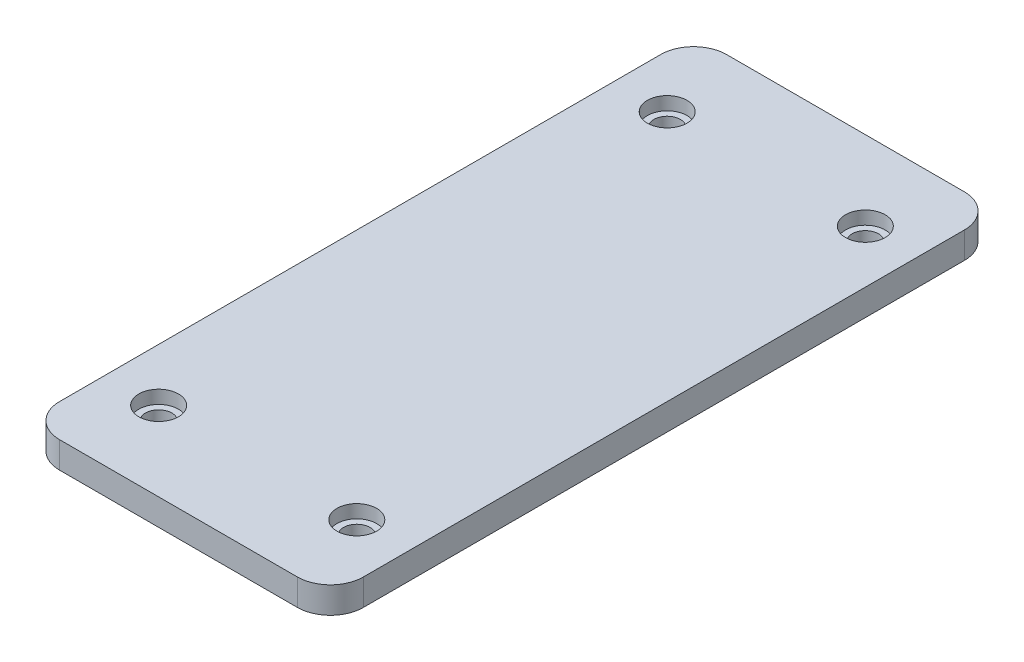
ISO-10303-21;
HEADER;
FILE_DESCRIPTION(('STEP AP214'),'2;1');
FILE_NAME('part.step','',(''),(''),'','','');
FILE_SCHEMA(('AUTOMOTIVE_DESIGN { 1 0 10303 214 1 1 1 1 }'));
ENDSEC;
DATA;
#1=APPLICATION_CONTEXT('core data for automotive mechanical design processes');
#2=APPLICATION_PROTOCOL_DEFINITION('international standard','automotive_design',2000,#1);
#3=PRODUCT_CONTEXT('',#1,'mechanical');
#4=PRODUCT('Part','Part','',(#3));
#5=PRODUCT_RELATED_PRODUCT_CATEGORY('part','',(#4));
#6=PRODUCT_DEFINITION_FORMATION('','',#4);
#7=PRODUCT_DEFINITION_CONTEXT('part definition',#1,'design');
#8=PRODUCT_DEFINITION('design','',#6,#7);
#9=PRODUCT_DEFINITION_SHAPE('','',#8);
#10=(LENGTH_UNIT() NAMED_UNIT(*) SI_UNIT(.MILLI.,.METRE.));
#11=(NAMED_UNIT(*) PLANE_ANGLE_UNIT() SI_UNIT($,.RADIAN.));
#12=(NAMED_UNIT(*) SI_UNIT($,.STERADIAN.) SOLID_ANGLE_UNIT());
#13=UNCERTAINTY_MEASURE_WITH_UNIT(LENGTH_MEASURE(1.E-05),#10,'distance_accuracy_value','');
#14=(GEOMETRIC_REPRESENTATION_CONTEXT(3) GLOBAL_UNCERTAINTY_ASSIGNED_CONTEXT((#13)) GLOBAL_UNIT_ASSIGNED_CONTEXT((#10,
#11,#12)) REPRESENTATION_CONTEXT('',''));
#15=CARTESIAN_POINT('',(0.,0.,0.));
#16=DIRECTION('',(0.,0.,1.));
#17=DIRECTION('',(1.,0.,0.));
#18=AXIS2_PLACEMENT_3D('',#15,#16,#17);
#19=CARTESIAN_POINT('',(15.,-32.,-38.5));
#20=DIRECTION('',(0.,1.,0.));
#21=DIRECTION('',(0.,0.,1.));
#22=AXIS2_PLACEMENT_3D('',#19,#20,#21);
#23=CYLINDRICAL_SURFACE('',#22,2.);
#24=CARTESIAN_POINT('',(15.,0.,-38.5));
#25=DIRECTION('',(0.,1.,0.));
#26=DIRECTION('',(0.,0.,1.));
#27=AXIS2_PLACEMENT_3D('',#24,#25,#26);
#28=CIRCLE('',#27,2.);
#29=CARTESIAN_POINT('',(15.,0.,-36.5));
#30=VERTEX_POINT('',#29);
#31=EDGE_CURVE('E135',#30,#30,#28,.F.);
#32=ORIENTED_EDGE('',*,*,#31,.T.);
#33=EDGE_LOOP('',(#32));
#34=FACE_BOUND('',#33,.T.);
#35=CARTESIAN_POINT('',(15.,2.,-38.5));
#36=DIRECTION('',(0.,1.,0.));
#37=DIRECTION('',(0.,0.,1.));
#38=AXIS2_PLACEMENT_3D('',#35,#36,#37);
#39=CIRCLE('',#38,2.);
#40=CARTESIAN_POINT('',(15.,2.,-36.5));
#41=VERTEX_POINT('',#40);
#42=EDGE_CURVE('E158',#41,#41,#39,.T.);
#43=ORIENTED_EDGE('',*,*,#42,.T.);
#44=EDGE_LOOP('',(#43));
#45=FACE_BOUND('',#44,.T.);
#46=ADVANCED_FACE('F32',(#34,#45),#23,.F.);
#47=CARTESIAN_POINT('',(-15.,-32.,-38.5));
#48=DIRECTION('',(0.,1.,0.));
#49=DIRECTION('',(0.,0.,1.));
#50=AXIS2_PLACEMENT_3D('',#47,#48,#49);
#51=CYLINDRICAL_SURFACE('',#50,2.);
#52=CARTESIAN_POINT('',(-15.,0.,-38.5));
#53=DIRECTION('',(0.,1.,0.));
#54=DIRECTION('',(0.,0.,1.));
#55=AXIS2_PLACEMENT_3D('',#52,#53,#54);
#56=CIRCLE('',#55,2.);
#57=CARTESIAN_POINT('',(-15.,0.,-36.5));
#58=VERTEX_POINT('',#57);
#59=EDGE_CURVE('E132',#58,#58,#56,.T.);
#60=ORIENTED_EDGE('',*,*,#59,.F.);
#61=EDGE_LOOP('',(#60));
#62=FACE_BOUND('',#61,.T.);
#63=CARTESIAN_POINT('',(-15.,2.,-38.5));
#64=DIRECTION('',(0.,1.,0.));
#65=DIRECTION('',(0.,0.,1.));
#66=AXIS2_PLACEMENT_3D('',#63,#64,#65);
#67=CIRCLE('',#66,2.);
#68=CARTESIAN_POINT('',(-15.,2.,-36.5));
#69=VERTEX_POINT('',#68);
#70=EDGE_CURVE('E153',#69,#69,#67,.F.);
#71=ORIENTED_EDGE('',*,*,#70,.F.);
#72=EDGE_LOOP('',(#71));
#73=FACE_BOUND('',#72,.T.);
#74=ADVANCED_FACE('F226',(#62,#73),#51,.F.);
#75=CARTESIAN_POINT('',(15.,-32.,38.5));
#76=DIRECTION('',(0.,1.,0.));
#77=DIRECTION('',(0.,0.,1.));
#78=AXIS2_PLACEMENT_3D('',#75,#76,#77);
#79=CYLINDRICAL_SURFACE('',#78,2.);
#80=CARTESIAN_POINT('',(15.,0.,38.5));
#81=DIRECTION('',(0.,1.,0.));
#82=DIRECTION('',(0.,0.,1.));
#83=AXIS2_PLACEMENT_3D('',#80,#81,#82);
#84=CIRCLE('',#83,2.);
#85=CARTESIAN_POINT('',(15.,0.,40.5));
#86=VERTEX_POINT('',#85);
#87=EDGE_CURVE('E141',#86,#86,#84,.T.);
#88=ORIENTED_EDGE('',*,*,#87,.F.);
#89=EDGE_LOOP('',(#88));
#90=FACE_BOUND('',#89,.T.);
#91=CARTESIAN_POINT('',(15.,2.,38.5));
#92=DIRECTION('',(0.,1.,0.));
#93=DIRECTION('',(0.,0.,1.));
#94=AXIS2_PLACEMENT_3D('',#91,#92,#93);
#95=CIRCLE('',#94,2.);
#96=CARTESIAN_POINT('',(15.,2.,40.5));
#97=VERTEX_POINT('',#96);
#98=EDGE_CURVE('E148',#97,#97,#95,.F.);
#99=ORIENTED_EDGE('',*,*,#98,.F.);
#100=EDGE_LOOP('',(#99));
#101=FACE_BOUND('',#100,.T.);
#102=ADVANCED_FACE('F219',(#90,#101),#79,.F.);
#103=CARTESIAN_POINT('',(-15.,-32.,38.5));
#104=DIRECTION('',(0.,1.,0.));
#105=DIRECTION('',(0.,0.,1.));
#106=AXIS2_PLACEMENT_3D('',#103,#104,#105);
#107=CYLINDRICAL_SURFACE('',#106,2.);
#108=CARTESIAN_POINT('',(-15.,0.,38.5));
#109=DIRECTION('',(0.,1.,0.));
#110=DIRECTION('',(0.,0.,1.));
#111=AXIS2_PLACEMENT_3D('',#108,#109,#110);
#112=CIRCLE('',#111,2.);
#113=CARTESIAN_POINT('',(-15.,0.,40.5));
#114=VERTEX_POINT('',#113);
#115=EDGE_CURVE('E138',#114,#114,#112,.F.);
#116=ORIENTED_EDGE('',*,*,#115,.T.);
#117=EDGE_LOOP('',(#116));
#118=FACE_BOUND('',#117,.T.);
#119=CARTESIAN_POINT('',(-15.,2.,38.5));
#120=DIRECTION('',(0.,1.,0.));
#121=DIRECTION('',(0.,0.,1.));
#122=AXIS2_PLACEMENT_3D('',#119,#120,#121);
#123=CIRCLE('',#122,2.);
#124=CARTESIAN_POINT('',(-15.,2.,40.5));
#125=VERTEX_POINT('',#124);
#126=EDGE_CURVE('E144',#125,#125,#123,.T.);
#127=ORIENTED_EDGE('',*,*,#126,.T.);
#128=EDGE_LOOP('',(#127));
#129=FACE_BOUND('',#128,.T.);
#130=ADVANCED_FACE('F210',(#118,#129),#107,.F.);
#131=CARTESIAN_POINT('',(0.,4.,0.));
#132=DIRECTION('',(0.,1.,0.));
#133=DIRECTION('',(0.,0.,1.));
#134=AXIS2_PLACEMENT_3D('',#131,#132,#133);
#135=PLANE('',#134);
#136=CARTESIAN_POINT('',(15.,4.,-38.5));
#137=DIRECTION('',(0.,1.,0.));
#138=DIRECTION('',(0.,0.,1.));
#139=AXIS2_PLACEMENT_3D('',#136,#137,#138);
#140=CIRCLE('',#139,3.);
#141=CARTESIAN_POINT('',(15.,4.,-35.5));
#142=VERTEX_POINT('',#141);
#143=EDGE_CURVE('E278',#142,#142,#140,.T.);
#144=ORIENTED_EDGE('',*,*,#143,.F.);
#145=EDGE_LOOP('',(#144));
#146=FACE_BOUND('',#145,.T.);
#147=CARTESIAN_POINT('',(-15.,4.,-38.5));
#148=DIRECTION('',(0.,1.,0.));
#149=DIRECTION('',(0.,0.,1.));
#150=AXIS2_PLACEMENT_3D('',#147,#148,#149);
#151=CIRCLE('',#150,3.);
#152=CARTESIAN_POINT('',(-15.,4.,-35.5));
#153=VERTEX_POINT('',#152);
#154=EDGE_CURVE('E161',#153,#153,#151,.T.);
#155=ORIENTED_EDGE('',*,*,#154,.F.);
#156=EDGE_LOOP('',(#155));
#157=FACE_BOUND('',#156,.T.);
#158=CARTESIAN_POINT('',(15.,4.,38.5));
#159=DIRECTION('',(0.,1.,0.));
#160=DIRECTION('',(0.,0.,1.));
#161=AXIS2_PLACEMENT_3D('',#158,#159,#160);
#162=CIRCLE('',#161,3.);
#163=CARTESIAN_POINT('',(15.,4.,41.5));
#164=VERTEX_POINT('',#163);
#165=EDGE_CURVE('E156',#164,#164,#162,.T.);
#166=ORIENTED_EDGE('',*,*,#165,.F.);
#167=EDGE_LOOP('',(#166));
#168=FACE_BOUND('',#167,.T.);
#169=CARTESIAN_POINT('',(-15.,4.,38.5));
#170=DIRECTION('',(0.,1.,0.));
#171=DIRECTION('',(0.,0.,1.));
#172=AXIS2_PLACEMENT_3D('',#169,#170,#171);
#173=CIRCLE('',#172,3.);
#174=CARTESIAN_POINT('',(-15.,4.,41.5));
#175=VERTEX_POINT('',#174);
#176=EDGE_CURVE('E151',#175,#175,#173,.T.);
#177=ORIENTED_EDGE('',*,*,#176,.F.);
#178=EDGE_LOOP('',(#177));
#179=FACE_BOUND('',#178,.T.);
#180=DIRECTION('',(-1.,0.,0.));
#181=VECTOR('',#180,1.);
#182=CARTESIAN_POINT('',(-23.,4.,-50.5));
#183=LINE('',#182,#181);
#184=CARTESIAN_POINT('',(18.,4.,-50.5));
#185=VERTEX_POINT('',#184);
#186=CARTESIAN_POINT('',(-18.,4.,-50.5));
#187=VERTEX_POINT('',#186);
#188=EDGE_CURVE('E199',#185,#187,#183,.T.);
#189=ORIENTED_EDGE('',*,*,#188,.T.);
#190=CARTESIAN_POINT('',(-18.,4.,-45.5));
#191=DIRECTION('',(0.,1.,0.));
#192=DIRECTION('',(0.,0.,1.));
#193=AXIS2_PLACEMENT_3D('',#190,#191,#192);
#194=CIRCLE('',#193,5.);
#195=CARTESIAN_POINT('',(-23.,4.,-45.5));
#196=VERTEX_POINT('',#195);
#197=EDGE_CURVE('E177',#187,#196,#194,.T.);
#198=ORIENTED_EDGE('',*,*,#197,.T.);
#199=DIRECTION('',(0.,0.,1.));
#200=VECTOR('',#199,1.);
#201=CARTESIAN_POINT('',(-23.,4.,-50.5));
#202=LINE('',#201,#200);
#203=CARTESIAN_POINT('',(-23.,4.,45.5));
#204=VERTEX_POINT('',#203);
#205=EDGE_CURVE('E116',#196,#204,#202,.T.);
#206=ORIENTED_EDGE('',*,*,#205,.T.);
#207=CARTESIAN_POINT('',(-18.,4.,45.5));
#208=DIRECTION('',(0.,1.,0.));
#209=DIRECTION('',(0.,0.,1.));
#210=AXIS2_PLACEMENT_3D('',#207,#208,#209);
#211=CIRCLE('',#210,5.);
#212=CARTESIAN_POINT('',(-18.,4.,50.5));
#213=VERTEX_POINT('',#212);
#214=EDGE_CURVE('E52',#204,#213,#211,.T.);
#215=ORIENTED_EDGE('',*,*,#214,.T.);
#216=DIRECTION('',(1.,0.,0.));
#217=VECTOR('',#216,1.);
#218=CARTESIAN_POINT('',(-23.,4.,50.5));
#219=LINE('',#218,#217);
#220=CARTESIAN_POINT('',(18.,4.,50.5));
#221=VERTEX_POINT('',#220);
#222=EDGE_CURVE('E163',#213,#221,#219,.T.);
#223=ORIENTED_EDGE('',*,*,#222,.T.);
#224=CARTESIAN_POINT('',(18.,4.,45.5));
#225=DIRECTION('',(0.,1.,0.));
#226=DIRECTION('',(0.,0.,1.));
#227=AXIS2_PLACEMENT_3D('',#224,#225,#226);
#228=CIRCLE('',#227,5.);
#229=CARTESIAN_POINT('',(23.,4.,45.5));
#230=VERTEX_POINT('',#229);
#231=EDGE_CURVE('E173',#221,#230,#228,.T.);
#232=ORIENTED_EDGE('',*,*,#231,.T.);
#233=DIRECTION('',(0.,0.,-1.));
#234=VECTOR('',#233,1.);
#235=CARTESIAN_POINT('',(23.,4.,-50.5));
#236=LINE('',#235,#234);
#237=CARTESIAN_POINT('',(23.,4.,-45.5));
#238=VERTEX_POINT('',#237);
#239=EDGE_CURVE('E126',#230,#238,#236,.T.);
#240=ORIENTED_EDGE('',*,*,#239,.T.);
#241=CARTESIAN_POINT('',(18.,4.,-45.5));
#242=DIRECTION('',(0.,1.,0.));
#243=DIRECTION('',(0.,0.,1.));
#244=AXIS2_PLACEMENT_3D('',#241,#242,#243);
#245=CIRCLE('',#244,5.);
#246=EDGE_CURVE('E175',#238,#185,#245,.T.);
#247=ORIENTED_EDGE('',*,*,#246,.T.);
#248=EDGE_LOOP('',(#189,#198,#206,#215,#223,#232,#240,#247));
#249=FACE_BOUND('',#248,.T.);
#250=ADVANCED_FACE('F207',(#146,#157,#168,#179,#249),#135,.T.);
#251=CARTESIAN_POINT('',(0.,0.,0.));
#252=DIRECTION('',(0.,1.,0.));
#253=DIRECTION('',(0.,0.,1.));
#254=AXIS2_PLACEMENT_3D('',#251,#252,#253);
#255=PLANE('',#254);
#256=ORIENTED_EDGE('',*,*,#87,.T.);
#257=EDGE_LOOP('',(#256));
#258=FACE_BOUND('',#257,.T.);
#259=ORIENTED_EDGE('',*,*,#31,.F.);
#260=EDGE_LOOP('',(#259));
#261=FACE_BOUND('',#260,.T.);
#262=ORIENTED_EDGE('',*,*,#59,.T.);
#263=EDGE_LOOP('',(#262));
#264=FACE_BOUND('',#263,.T.);
#265=DIRECTION('',(0.,0.,1.));
#266=VECTOR('',#265,1.);
#267=CARTESIAN_POINT('',(-23.,0.,-50.5));
#268=LINE('',#267,#266);
#269=CARTESIAN_POINT('',(-23.,0.,-45.5));
#270=VERTEX_POINT('',#269);
#271=CARTESIAN_POINT('',(-23.,0.,45.5));
#272=VERTEX_POINT('',#271);
#273=EDGE_CURVE('E114',#270,#272,#268,.T.);
#274=ORIENTED_EDGE('',*,*,#273,.F.);
#275=CARTESIAN_POINT('',(-18.,0.,-45.5));
#276=DIRECTION('',(0.,1.,0.));
#277=DIRECTION('',(0.,0.,1.));
#278=AXIS2_PLACEMENT_3D('',#275,#276,#277);
#279=CIRCLE('',#278,5.);
#280=CARTESIAN_POINT('',(-18.,0.,-50.5));
#281=VERTEX_POINT('',#280);
#282=EDGE_CURVE('E97',#270,#281,#279,.F.);
#283=ORIENTED_EDGE('',*,*,#282,.T.);
#284=DIRECTION('',(-1.,0.,0.));
#285=VECTOR('',#284,1.);
#286=CARTESIAN_POINT('',(-23.,0.,-50.5));
#287=LINE('',#286,#285);
#288=CARTESIAN_POINT('',(18.,0.,-50.5));
#289=VERTEX_POINT('',#288);
#290=EDGE_CURVE('E124',#289,#281,#287,.T.);
#291=ORIENTED_EDGE('',*,*,#290,.F.);
#292=CARTESIAN_POINT('',(18.,0.,-45.5));
#293=DIRECTION('',(0.,1.,0.));
#294=DIRECTION('',(0.,0.,1.));
#295=AXIS2_PLACEMENT_3D('',#292,#293,#294);
#296=CIRCLE('',#295,5.);
#297=CARTESIAN_POINT('',(23.,0.,-45.5));
#298=VERTEX_POINT('',#297);
#299=EDGE_CURVE('E108',#289,#298,#296,.F.);
#300=ORIENTED_EDGE('',*,*,#299,.T.);
#301=DIRECTION('',(0.,0.,-1.));
#302=VECTOR('',#301,1.);
#303=CARTESIAN_POINT('',(23.,0.,-50.5));
#304=LINE('',#303,#302);
#305=CARTESIAN_POINT('',(23.,0.,45.5));
#306=VERTEX_POINT('',#305);
#307=EDGE_CURVE('E128',#306,#298,#304,.T.);
#308=ORIENTED_EDGE('',*,*,#307,.F.);
#309=CARTESIAN_POINT('',(18.,0.,45.5));
#310=DIRECTION('',(0.,1.,0.));
#311=DIRECTION('',(0.,0.,1.));
#312=AXIS2_PLACEMENT_3D('',#309,#310,#311);
#313=CIRCLE('',#312,5.);
#314=CARTESIAN_POINT('',(18.,0.,50.5));
#315=VERTEX_POINT('',#314);
#316=EDGE_CURVE('E166',#306,#315,#313,.F.);
#317=ORIENTED_EDGE('',*,*,#316,.T.);
#318=DIRECTION('',(1.,0.,0.));
#319=VECTOR('',#318,1.);
#320=CARTESIAN_POINT('',(-23.,0.,50.5));
#321=LINE('',#320,#319);
#322=CARTESIAN_POINT('',(-18.,0.,50.5));
#323=VERTEX_POINT('',#322);
#324=EDGE_CURVE('E123',#323,#315,#321,.T.);
#325=ORIENTED_EDGE('',*,*,#324,.F.);
#326=CARTESIAN_POINT('',(-18.,0.,45.5));
#327=DIRECTION('',(0.,1.,0.));
#328=DIRECTION('',(0.,0.,1.));
#329=AXIS2_PLACEMENT_3D('',#326,#327,#328);
#330=CIRCLE('',#329,5.);
#331=EDGE_CURVE('E117',#323,#272,#330,.F.);
#332=ORIENTED_EDGE('',*,*,#331,.T.);
#333=EDGE_LOOP('',(#274,#283,#291,#300,#308,#317,#325,#332));
#334=FACE_BOUND('',#333,.T.);
#335=ORIENTED_EDGE('',*,*,#115,.F.);
#336=EDGE_LOOP('',(#335));
#337=FACE_BOUND('',#336,.T.);
#338=ADVANCED_FACE('F120',(#258,#261,#264,#334,#337),#255,.F.);
#339=CARTESIAN_POINT('',(23.,4.,-50.5));
#340=DIRECTION('',(-1.,0.,0.));
#341=DIRECTION('',(0.,0.,1.));
#342=AXIS2_PLACEMENT_3D('',#339,#340,#341);
#343=PLANE('',#342);
#344=ORIENTED_EDGE('',*,*,#307,.T.);
#345=DIRECTION('',(0.,-1.,0.));
#346=VECTOR('',#345,1.);
#347=CARTESIAN_POINT('',(23.,4.,-45.5));
#348=LINE('',#347,#346);
#349=EDGE_CURVE('E182',#298,#238,#348,.F.);
#350=ORIENTED_EDGE('',*,*,#349,.T.);
#351=ORIENTED_EDGE('',*,*,#239,.F.);
#352=DIRECTION('',(0.,-1.,0.));
#353=VECTOR('',#352,1.);
#354=CARTESIAN_POINT('',(23.,4.,45.5));
#355=LINE('',#354,#353);
#356=EDGE_CURVE('E179',#230,#306,#355,.T.);
#357=ORIENTED_EDGE('',*,*,#356,.T.);
#358=EDGE_LOOP('',(#344,#350,#351,#357));
#359=FACE_BOUND('',#358,.T.);
#360=ADVANCED_FACE('F195',(#359),#343,.F.);
#361=CARTESIAN_POINT('',(-23.,4.,-50.5));
#362=DIRECTION('',(0.,0.,1.));
#363=DIRECTION('',(1.,0.,0.));
#364=AXIS2_PLACEMENT_3D('',#361,#362,#363);
#365=PLANE('',#364);
#366=ORIENTED_EDGE('',*,*,#290,.T.);
#367=DIRECTION('',(0.,-1.,0.));
#368=VECTOR('',#367,1.);
#369=CARTESIAN_POINT('',(-18.,4.,-50.5));
#370=LINE('',#369,#368);
#371=EDGE_CURVE('E102',#281,#187,#370,.F.);
#372=ORIENTED_EDGE('',*,*,#371,.T.);
#373=ORIENTED_EDGE('',*,*,#188,.F.);
#374=DIRECTION('',(0.,-1.,0.));
#375=VECTOR('',#374,1.);
#376=CARTESIAN_POINT('',(18.,4.,-50.5));
#377=LINE('',#376,#375);
#378=EDGE_CURVE('E107',#185,#289,#377,.T.);
#379=ORIENTED_EDGE('',*,*,#378,.T.);
#380=EDGE_LOOP('',(#366,#372,#373,#379));
#381=FACE_BOUND('',#380,.T.);
#382=ADVANCED_FACE('F357',(#381),#365,.F.);
#383=CARTESIAN_POINT('',(-23.,4.,-50.5));
#384=DIRECTION('',(1.,0.,0.));
#385=DIRECTION('',(0.,0.,-1.));
#386=AXIS2_PLACEMENT_3D('',#383,#384,#385);
#387=PLANE('',#386);
#388=ORIENTED_EDGE('',*,*,#205,.F.);
#389=DIRECTION('',(0.,-1.,0.));
#390=VECTOR('',#389,1.);
#391=CARTESIAN_POINT('',(-23.,4.,-45.5));
#392=LINE('',#391,#390);
#393=EDGE_CURVE('E101',#196,#270,#392,.T.);
#394=ORIENTED_EDGE('',*,*,#393,.T.);
#395=ORIENTED_EDGE('',*,*,#273,.T.);
#396=DIRECTION('',(0.,-1.,0.));
#397=VECTOR('',#396,1.);
#398=CARTESIAN_POINT('',(-23.,4.,45.5));
#399=LINE('',#398,#397);
#400=EDGE_CURVE('E118',#272,#204,#399,.F.);
#401=ORIENTED_EDGE('',*,*,#400,.T.);
#402=EDGE_LOOP('',(#388,#394,#395,#401));
#403=FACE_BOUND('',#402,.T.);
#404=ADVANCED_FACE('F113',(#403),#387,.F.);
#405=CARTESIAN_POINT('',(-23.,4.,50.5));
#406=DIRECTION('',(0.,0.,-1.));
#407=DIRECTION('',(-1.,0.,0.));
#408=AXIS2_PLACEMENT_3D('',#405,#406,#407);
#409=PLANE('',#408);
#410=ORIENTED_EDGE('',*,*,#324,.T.);
#411=DIRECTION('',(0.,-1.,0.));
#412=VECTOR('',#411,1.);
#413=CARTESIAN_POINT('',(18.,4.,50.5));
#414=LINE('',#413,#412);
#415=EDGE_CURVE('E11',#315,#221,#414,.F.);
#416=ORIENTED_EDGE('',*,*,#415,.T.);
#417=ORIENTED_EDGE('',*,*,#222,.F.);
#418=DIRECTION('',(0.,-1.,0.));
#419=VECTOR('',#418,1.);
#420=CARTESIAN_POINT('',(-18.,4.,50.5));
#421=LINE('',#420,#419);
#422=EDGE_CURVE('E40',#213,#323,#421,.T.);
#423=ORIENTED_EDGE('',*,*,#422,.T.);
#424=EDGE_LOOP('',(#410,#416,#417,#423));
#425=FACE_BOUND('',#424,.T.);
#426=ADVANCED_FACE('F185',(#425),#409,.F.);
#427=CARTESIAN_POINT('',(-15.,2.,38.5));
#428=DIRECTION('',(0.,1.,0.));
#429=DIRECTION('',(0.,0.,1.));
#430=AXIS2_PLACEMENT_3D('',#427,#428,#429);
#431=CYLINDRICAL_SURFACE('',#430,3.);
#432=CARTESIAN_POINT('',(-15.,2.,38.5));
#433=DIRECTION('',(0.,1.,0.));
#434=DIRECTION('',(0.,0.,1.));
#435=AXIS2_PLACEMENT_3D('',#432,#433,#434);
#436=CIRCLE('',#435,3.);
#437=CARTESIAN_POINT('',(-15.,2.,41.5));
#438=VERTEX_POINT('',#437);
#439=EDGE_CURVE('E147',#438,#438,#436,.T.);
#440=ORIENTED_EDGE('',*,*,#439,.F.);
#441=EDGE_LOOP('',(#440));
#442=FACE_BOUND('',#441,.T.);
#443=ORIENTED_EDGE('',*,*,#176,.T.);
#444=EDGE_LOOP('',(#443));
#445=FACE_BOUND('',#444,.T.);
#446=ADVANCED_FACE('F238',(#442,#445),#431,.F.);
#447=CARTESIAN_POINT('',(-15.,2.,38.5));
#448=DIRECTION('',(0.,1.,0.));
#449=DIRECTION('',(0.,0.,1.));
#450=AXIS2_PLACEMENT_3D('',#447,#448,#449);
#451=PLANE('',#450);
#452=ORIENTED_EDGE('',*,*,#126,.F.);
#453=EDGE_LOOP('',(#452));
#454=FACE_BOUND('',#453,.T.);
#455=ORIENTED_EDGE('',*,*,#439,.T.);
#456=EDGE_LOOP('',(#455));
#457=FACE_BOUND('',#456,.T.);
#458=ADVANCED_FACE('F241',(#454,#457),#451,.T.);
#459=CARTESIAN_POINT('',(15.,2.,38.5));
#460=DIRECTION('',(0.,1.,0.));
#461=DIRECTION('',(0.,0.,1.));
#462=AXIS2_PLACEMENT_3D('',#459,#460,#461);
#463=PLANE('',#462);
#464=CARTESIAN_POINT('',(15.,2.,38.5));
#465=DIRECTION('',(0.,1.,0.));
#466=DIRECTION('',(0.,0.,1.));
#467=AXIS2_PLACEMENT_3D('',#464,#465,#466);
#468=CIRCLE('',#467,3.);
#469=CARTESIAN_POINT('',(15.,2.,41.5));
#470=VERTEX_POINT('',#469);
#471=EDGE_CURVE('E152',#470,#470,#468,.T.);
#472=ORIENTED_EDGE('',*,*,#471,.T.);
#473=EDGE_LOOP('',(#472));
#474=FACE_BOUND('',#473,.T.);
#475=ORIENTED_EDGE('',*,*,#98,.T.);
#476=EDGE_LOOP('',(#475));
#477=FACE_BOUND('',#476,.T.);
#478=ADVANCED_FACE('F245',(#474,#477),#463,.T.);
#479=CARTESIAN_POINT('',(15.,2.,38.5));
#480=DIRECTION('',(0.,1.,0.));
#481=DIRECTION('',(0.,0.,1.));
#482=AXIS2_PLACEMENT_3D('',#479,#480,#481);
#483=CYLINDRICAL_SURFACE('',#482,3.);
#484=ORIENTED_EDGE('',*,*,#471,.F.);
#485=EDGE_LOOP('',(#484));
#486=FACE_BOUND('',#485,.T.);
#487=ORIENTED_EDGE('',*,*,#165,.T.);
#488=EDGE_LOOP('',(#487));
#489=FACE_BOUND('',#488,.T.);
#490=ADVANCED_FACE('F247',(#486,#489),#483,.F.);
#491=CARTESIAN_POINT('',(-15.,2.,-38.5));
#492=DIRECTION('',(0.,1.,0.));
#493=DIRECTION('',(0.,0.,1.));
#494=AXIS2_PLACEMENT_3D('',#491,#492,#493);
#495=PLANE('',#494);
#496=CARTESIAN_POINT('',(-15.,2.,-38.5));
#497=DIRECTION('',(0.,1.,0.));
#498=DIRECTION('',(0.,0.,1.));
#499=AXIS2_PLACEMENT_3D('',#496,#497,#498);
#500=CIRCLE('',#499,3.);
#501=CARTESIAN_POINT('',(-15.,2.,-35.5));
#502=VERTEX_POINT('',#501);
#503=EDGE_CURVE('E157',#502,#502,#500,.T.);
#504=ORIENTED_EDGE('',*,*,#503,.T.);
#505=EDGE_LOOP('',(#504));
#506=FACE_BOUND('',#505,.T.);
#507=ORIENTED_EDGE('',*,*,#70,.T.);
#508=EDGE_LOOP('',(#507));
#509=FACE_BOUND('',#508,.T.);
#510=ADVANCED_FACE('F250',(#506,#509),#495,.T.);
#511=CARTESIAN_POINT('',(-15.,2.,-38.5));
#512=DIRECTION('',(0.,1.,0.));
#513=DIRECTION('',(0.,0.,1.));
#514=AXIS2_PLACEMENT_3D('',#511,#512,#513);
#515=CYLINDRICAL_SURFACE('',#514,3.);
#516=ORIENTED_EDGE('',*,*,#503,.F.);
#517=EDGE_LOOP('',(#516));
#518=FACE_BOUND('',#517,.T.);
#519=ORIENTED_EDGE('',*,*,#154,.T.);
#520=EDGE_LOOP('',(#519));
#521=FACE_BOUND('',#520,.T.);
#522=ADVANCED_FACE('F255',(#518,#521),#515,.F.);
#523=CARTESIAN_POINT('',(15.,2.,-38.5));
#524=DIRECTION('',(0.,1.,0.));
#525=DIRECTION('',(0.,0.,1.));
#526=AXIS2_PLACEMENT_3D('',#523,#524,#525);
#527=CYLINDRICAL_SURFACE('',#526,3.);
#528=CARTESIAN_POINT('',(15.,2.,-38.5));
#529=DIRECTION('',(0.,1.,0.));
#530=DIRECTION('',(0.,0.,1.));
#531=AXIS2_PLACEMENT_3D('',#528,#529,#530);
#532=CIRCLE('',#531,3.);
#533=CARTESIAN_POINT('',(15.,2.,-35.5));
#534=VERTEX_POINT('',#533);
#535=EDGE_CURVE('E162',#534,#534,#532,.T.);
#536=ORIENTED_EDGE('',*,*,#535,.F.);
#537=EDGE_LOOP('',(#536));
#538=FACE_BOUND('',#537,.T.);
#539=ORIENTED_EDGE('',*,*,#143,.T.);
#540=EDGE_LOOP('',(#539));
#541=FACE_BOUND('',#540,.T.);
#542=ADVANCED_FACE('F258',(#538,#541),#527,.F.);
#543=CARTESIAN_POINT('',(15.,2.,-38.5));
#544=DIRECTION('',(0.,1.,0.));
#545=DIRECTION('',(0.,0.,1.));
#546=AXIS2_PLACEMENT_3D('',#543,#544,#545);
#547=PLANE('',#546);
#548=ORIENTED_EDGE('',*,*,#42,.F.);
#549=EDGE_LOOP('',(#548));
#550=FACE_BOUND('',#549,.T.);
#551=ORIENTED_EDGE('',*,*,#535,.T.);
#552=EDGE_LOOP('',(#551));
#553=FACE_BOUND('',#552,.T.);
#554=ADVANCED_FACE('F265',(#550,#553),#547,.T.);
#555=CARTESIAN_POINT('',(-18.,4.,-45.5));
#556=DIRECTION('',(0.,-1.,0.));
#557=DIRECTION('',(0.,0.,-1.));
#558=AXIS2_PLACEMENT_3D('',#555,#556,#557);
#559=CYLINDRICAL_SURFACE('',#558,5.);
#560=ORIENTED_EDGE('',*,*,#197,.F.);
#561=ORIENTED_EDGE('',*,*,#371,.F.);
#562=ORIENTED_EDGE('',*,*,#282,.F.);
#563=ORIENTED_EDGE('',*,*,#393,.F.);
#564=EDGE_LOOP('',(#560,#561,#562,#563));
#565=FACE_BOUND('',#564,.T.);
#566=ADVANCED_FACE('F100',(#565),#559,.T.);
#567=CARTESIAN_POINT('',(18.,4.,-45.5));
#568=DIRECTION('',(0.,-1.,0.));
#569=DIRECTION('',(0.,0.,-1.));
#570=AXIS2_PLACEMENT_3D('',#567,#568,#569);
#571=CYLINDRICAL_SURFACE('',#570,5.);
#572=ORIENTED_EDGE('',*,*,#246,.F.);
#573=ORIENTED_EDGE('',*,*,#349,.F.);
#574=ORIENTED_EDGE('',*,*,#299,.F.);
#575=ORIENTED_EDGE('',*,*,#378,.F.);
#576=EDGE_LOOP('',(#572,#573,#574,#575));
#577=FACE_BOUND('',#576,.T.);
#578=ADVANCED_FACE('F272',(#577),#571,.T.);
#579=CARTESIAN_POINT('',(18.,4.,45.5));
#580=DIRECTION('',(0.,-1.,0.));
#581=DIRECTION('',(0.,0.,-1.));
#582=AXIS2_PLACEMENT_3D('',#579,#580,#581);
#583=CYLINDRICAL_SURFACE('',#582,5.);
#584=ORIENTED_EDGE('',*,*,#231,.F.);
#585=ORIENTED_EDGE('',*,*,#415,.F.);
#586=ORIENTED_EDGE('',*,*,#316,.F.);
#587=ORIENTED_EDGE('',*,*,#356,.F.);
#588=EDGE_LOOP('',(#584,#585,#586,#587));
#589=FACE_BOUND('',#588,.T.);
#590=ADVANCED_FACE('F192',(#589),#583,.T.);
#591=CARTESIAN_POINT('',(-18.,4.,45.5));
#592=DIRECTION('',(0.,-1.,0.));
#593=DIRECTION('',(0.,0.,-1.));
#594=AXIS2_PLACEMENT_3D('',#591,#592,#593);
#595=CYLINDRICAL_SURFACE('',#594,5.);
#596=ORIENTED_EDGE('',*,*,#214,.F.);
#597=ORIENTED_EDGE('',*,*,#400,.F.);
#598=ORIENTED_EDGE('',*,*,#331,.F.);
#599=ORIENTED_EDGE('',*,*,#422,.F.);
#600=EDGE_LOOP('',(#596,#597,#598,#599));
#601=FACE_BOUND('',#600,.T.);
#602=ADVANCED_FACE('F34',(#601),#595,.T.);
#603=CLOSED_SHELL('',(#46,#74,#102,#130,#250,#338,#360,#382,#404,#426,#446,#458,#478,#490,#510,
#522,#542,#554,#566,#578,#590,#602));
#604=MANIFOLD_SOLID_BREP('B2',#603);
#605=ADVANCED_BREP_SHAPE_REPRESENTATION('',(#18,#604),#14);
#606=SHAPE_DEFINITION_REPRESENTATION(#9,#605);
ENDSEC;
END-ISO-10303-21;
